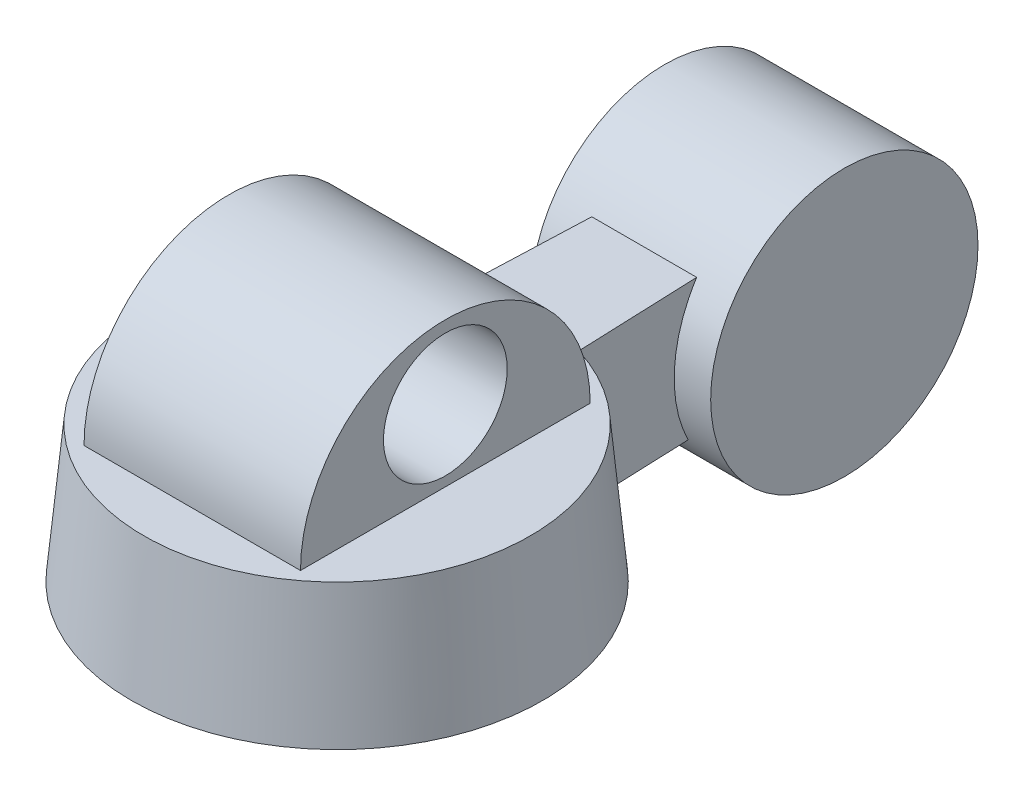
ISO-10303-21;
HEADER;
FILE_DESCRIPTION(('STEP AP214'),'2;1');
FILE_NAME('part.step','',(''),(''),'','','');
FILE_SCHEMA(('AUTOMOTIVE_DESIGN { 1 0 10303 214 1 1 1 1 }'));
ENDSEC;
DATA;
#1=APPLICATION_CONTEXT('core data for automotive mechanical design processes');
#2=APPLICATION_PROTOCOL_DEFINITION('international standard','automotive_design',2000,#1);
#3=PRODUCT_CONTEXT('',#1,'mechanical');
#4=PRODUCT('Part','Part','',(#3));
#5=PRODUCT_RELATED_PRODUCT_CATEGORY('part','',(#4));
#6=PRODUCT_DEFINITION_FORMATION('','',#4);
#7=PRODUCT_DEFINITION_CONTEXT('part definition',#1,'design');
#8=PRODUCT_DEFINITION('design','',#6,#7);
#9=PRODUCT_DEFINITION_SHAPE('','',#8);
#10=(LENGTH_UNIT() NAMED_UNIT(*) SI_UNIT(.MILLI.,.METRE.));
#11=(NAMED_UNIT(*) PLANE_ANGLE_UNIT() SI_UNIT($,.RADIAN.));
#12=(NAMED_UNIT(*) SI_UNIT($,.STERADIAN.) SOLID_ANGLE_UNIT());
#13=UNCERTAINTY_MEASURE_WITH_UNIT(LENGTH_MEASURE(1.E-05),#10,'distance_accuracy_value','');
#14=(GEOMETRIC_REPRESENTATION_CONTEXT(3) GLOBAL_UNCERTAINTY_ASSIGNED_CONTEXT((#13)) GLOBAL_UNIT_ASSIGNED_CONTEXT((#10,
#11,#12)) REPRESENTATION_CONTEXT('',''));
#15=CARTESIAN_POINT('',(0.,0.,0.));
#16=DIRECTION('',(0.,0.,1.));
#17=DIRECTION('',(1.,0.,0.));
#18=AXIS2_PLACEMENT_3D('',#15,#16,#17);
#19=CARTESIAN_POINT('',(0.,30.655768,0.));
#20=DIRECTION('',(0.,-1.,0.));
#21=DIRECTION('',(0.,0.,-1.));
#22=AXIS2_PLACEMENT_3D('',#19,#20,#21);
#23=CONICAL_SURFACE('',#22,43.5102,0.0933546059476239);
#24=CARTESIAN_POINT('',(0.,0.,0.));
#25=DIRECTION('',(0.,1.,0.));
#26=DIRECTION('',(0.,0.,1.));
#27=AXIS2_PLACEMENT_3D('',#24,#25,#26);
#28=CIRCLE('',#27,46.3804);
#29=CARTESIAN_POINT('',(-12.7674188321028,0.,-44.5885021112581));
#30=VERTEX_POINT('',#29);
#31=CARTESIAN_POINT('',(12.7674188321028,0.,-44.5885021112581));
#32=VERTEX_POINT('',#31);
#33=EDGE_CURVE('E165',#30,#32,#28,.T.);
#34=ORIENTED_EDGE('',*,*,#33,.T.);
#35=CARTESIAN_POINT('',(12.7674180703374,-0.0002,-44.5885218072551));
#36=CARTESIAN_POINT('',(12.7771487536088,2.55456907930935,-44.336927921107));
#37=CARTESIAN_POINT('',(12.7868874687462,5.10931768078186,-44.085126365225));
#38=CARTESIAN_POINT('',(12.8063818661739,10.2187714563628,-43.5810845553975));
#39=CARTESIAN_POINT('',(12.8161375484635,12.7734766304726,-43.3288443014663));
#40=CARTESIAN_POINT('',(12.8356667842856,17.8828412553839,-42.8239017196377));
#41=CARTESIAN_POINT('',(12.8454403378181,20.4375007061853,-42.5711993917388));
#42=CARTESIAN_POINT('',(12.8650063248149,25.5467712850946,-42.0653065815872));
#43=CARTESIAN_POINT('',(12.8747987582797,28.1013824132008,-41.8121160993185));
#44=CARTESIAN_POINT('',(12.8846011357482,30.655968,-41.5586685076115));
#45=B_SPLINE_CURVE_WITH_KNOTS('',3,(#35,#36,#37,#38,#39,#40,#41,#42,#43,#44),.UNSPECIFIED.,.F.,
.F.,(4,2,2,2,4),(0.,7.7014383672306,15.4028764810343,23.1043146177772,30.8057530079677),.UNSPECIFIED.);
#46=CARTESIAN_POINT('',(12.8846003683133,30.655768,-41.5586883501977));
#47=VERTEX_POINT('',#46);
#48=EDGE_CURVE('E114',#32,#47,#45,.T.);
#49=ORIENTED_EDGE('',*,*,#48,.T.);
#50=CARTESIAN_POINT('',(0.,30.655768,0.));
#51=DIRECTION('',(0.,1.,0.));
#52=DIRECTION('',(0.,0.,1.));
#53=AXIS2_PLACEMENT_3D('',#50,#51,#52);
#54=CIRCLE('',#53,43.5102);
#55=CARTESIAN_POINT('',(-12.8846003683133,30.655768,-41.5586883501977));
#56=VERTEX_POINT('',#55);
#57=EDGE_CURVE('E41',#56,#47,#54,.T.);
#58=ORIENTED_EDGE('',*,*,#57,.F.);
#59=CARTESIAN_POINT('',(-12.8846011357482,30.655968,-41.5586685076115));
#60=CARTESIAN_POINT('',(-12.8747987582797,28.1013824132008,-41.8121160993185));
#61=CARTESIAN_POINT('',(-12.8650063248149,25.5467712850946,-42.0653065815872));
#62=CARTESIAN_POINT('',(-12.8454403378181,20.4375007061853,-42.5711993917388));
#63=CARTESIAN_POINT('',(-12.8356667842856,17.8828412553839,-42.8239017196377));
#64=CARTESIAN_POINT('',(-12.8161375484635,12.7734766304726,-43.3288443014663));
#65=CARTESIAN_POINT('',(-12.8063818661739,10.2187714563627,-43.5810845553975));
#66=CARTESIAN_POINT('',(-12.7868874687462,5.10931768078186,-44.085126365225));
#67=CARTESIAN_POINT('',(-12.7771487536088,2.55456907930935,-44.336927921107));
#68=CARTESIAN_POINT('',(-12.7674180703374,-0.000200000000001914,-44.5885218072551));
#69=B_SPLINE_CURVE_WITH_KNOTS('',3,(#59,#60,#61,#62,#63,#64,#65,#66,#67,#68),.UNSPECIFIED.,.F.,
.F.,(4,2,2,2,4),(0.,7.70143839019049,15.4028765269334,23.1043146407371,30.8057530079677),.UNSPECIFIED.);
#70=EDGE_CURVE('E99',#56,#30,#69,.T.);
#71=ORIENTED_EDGE('',*,*,#70,.T.);
#72=EDGE_LOOP('',(#34,#49,#58,#71));
#73=FACE_BOUND('',#72,.T.);
#74=ADVANCED_FACE('F33',(#73),#23,.T.);
#75=CARTESIAN_POINT('',(-43.5102,30.655768,0.));
#76=DIRECTION('',(0.,1.,0.));
#77=DIRECTION('',(0.,0.,1.));
#78=AXIS2_PLACEMENT_3D('',#75,#76,#77);
#79=PLANE('',#78);
#80=DIRECTION('',(1.,0.,0.));
#81=VECTOR('',#80,1.);
#82=CARTESIAN_POINT('',(-20.236561,30.655768,-69.1785868719033));
#83=LINE('',#82,#81);
#84=CARTESIAN_POINT('',(-11.8163689871146,30.655768,-69.1785868719033));
#85=VERTEX_POINT('',#84);
#86=CARTESIAN_POINT('',(11.8163689871146,30.655768,-69.1785868719033));
#87=VERTEX_POINT('',#86);
#88=EDGE_CURVE('E85',#85,#87,#83,.T.);
#89=ORIENTED_EDGE('',*,*,#88,.F.);
#90=DIRECTION('',(-0.0386472572103373,0.,0.999252915687574));
#91=VECTOR('',#90,1.);
#92=CARTESIAN_POINT('',(-12.72794,30.655768,-45.609256));
#93=LINE('',#92,#91);
#94=EDGE_CURVE('E55',#85,#56,#93,.T.);
#95=ORIENTED_EDGE('',*,*,#94,.T.);
#96=ORIENTED_EDGE('',*,*,#57,.T.);
#97=DIRECTION('',(-0.0386472572103373,0.,-0.999252915687574));
#98=VECTOR('',#97,1.);
#99=CARTESIAN_POINT('',(12.9276453556837,30.655768,-40.4457289258982));
#100=LINE('',#99,#98);
#101=EDGE_CURVE('E93',#47,#87,#100,.T.);
#102=ORIENTED_EDGE('',*,*,#101,.T.);
#103=EDGE_LOOP('',(#89,#95,#96,#102));
#104=FACE_BOUND('',#103,.T.);
#105=DIRECTION('',(0.,0.,-1.));
#106=VECTOR('',#105,1.);
#107=CARTESIAN_POINT('',(-24.380571,30.655768,0.));
#108=LINE('',#107,#106);
#109=CARTESIAN_POINT('',(-24.380571,30.655768,32.625284));
#110=VERTEX_POINT('',#109);
#111=CARTESIAN_POINT('',(-24.380571,30.655768,-32.625284));
#112=VERTEX_POINT('',#111);
#113=EDGE_CURVE('E299',#110,#112,#108,.T.);
#114=ORIENTED_EDGE('',*,*,#113,.T.);
#115=DIRECTION('',(1.,0.,0.));
#116=VECTOR('',#115,1.);
#117=CARTESIAN_POINT('',(-24.380571,30.655768,-32.625284));
#118=LINE('',#117,#116);
#119=CARTESIAN_POINT('',(24.380571,30.655768,-32.625284));
#120=VERTEX_POINT('',#119);
#121=EDGE_CURVE('E291',#112,#120,#118,.T.);
#122=ORIENTED_EDGE('',*,*,#121,.T.);
#123=DIRECTION('',(0.,0.,-1.));
#124=VECTOR('',#123,1.);
#125=CARTESIAN_POINT('',(24.380571,30.655768,0.));
#126=LINE('',#125,#124);
#127=CARTESIAN_POINT('',(24.380571,30.655768,32.625284));
#128=VERTEX_POINT('',#127);
#129=EDGE_CURVE('E307',#128,#120,#126,.T.);
#130=ORIENTED_EDGE('',*,*,#129,.F.);
#131=DIRECTION('',(1.,0.,0.));
#132=VECTOR('',#131,1.);
#133=CARTESIAN_POINT('',(-24.380571,30.655768,32.625284));
#134=LINE('',#133,#132);
#135=EDGE_CURVE('E169',#110,#128,#134,.T.);
#136=ORIENTED_EDGE('',*,*,#135,.F.);
#137=EDGE_LOOP('',(#114,#122,#130,#136));
#138=FACE_BOUND('',#137,.T.);
#139=ADVANCED_FACE('F90',(#104,#138),#79,.T.);
#140=CARTESIAN_POINT('',(0.,11.70178,0.));
#141=DIRECTION('',(0.,-1.,0.));
#142=DIRECTION('',(0.,0.,-1.));
#143=AXIS2_PLACEMENT_3D('',#140,#141,#142);
#144=PLANE('',#143);
#145=CARTESIAN_POINT('',(0.,11.70178,0.));
#146=DIRECTION('',(0.,1.,0.));
#147=DIRECTION('',(0.,0.,1.));
#148=AXIS2_PLACEMENT_3D('',#145,#146,#147);
#149=CIRCLE('',#148,40.3145498);
#150=CARTESIAN_POINT('',(0.,11.70178,40.3145498));
#151=VERTEX_POINT('',#150);
#152=EDGE_CURVE('E286',#151,#151,#149,.T.);
#153=ORIENTED_EDGE('',*,*,#152,.F.);
#154=EDGE_LOOP('',(#153));
#155=FACE_BOUND('',#154,.T.);
#156=ADVANCED_FACE('F152',(#155),#144,.T.);
#157=CARTESIAN_POINT('',(0.,0.,0.));
#158=DIRECTION('',(0.,1.,0.));
#159=DIRECTION('',(0.,0.,1.));
#160=AXIS2_PLACEMENT_3D('',#157,#158,#159);
#161=CYLINDRICAL_SURFACE('',#160,40.3145498);
#162=ORIENTED_EDGE('',*,*,#152,.T.);
#163=EDGE_LOOP('',(#162));
#164=FACE_BOUND('',#163,.T.);
#165=CARTESIAN_POINT('',(0.,0.,0.));
#166=DIRECTION('',(0.,1.,0.));
#167=DIRECTION('',(0.,0.,1.));
#168=AXIS2_PLACEMENT_3D('',#165,#166,#167);
#169=CIRCLE('',#168,40.3145498);
#170=CARTESIAN_POINT('',(0.,0.,40.3145498));
#171=VERTEX_POINT('',#170);
#172=EDGE_CURVE('E168',#171,#171,#169,.T.);
#173=ORIENTED_EDGE('',*,*,#172,.F.);
#174=EDGE_LOOP('',(#173));
#175=FACE_BOUND('',#174,.T.);
#176=ADVANCED_FACE('F148',(#164,#175),#161,.F.);
#177=CARTESIAN_POINT('',(-40.3145498,0.,0.));
#178=DIRECTION('',(0.,-1.,0.));
#179=DIRECTION('',(0.,0.,-1.));
#180=AXIS2_PLACEMENT_3D('',#177,#178,#179);
#181=PLANE('',#180);
#182=DIRECTION('',(1.,0.,0.));
#183=VECTOR('',#182,1.);
#184=CARTESIAN_POINT('',(-20.236561,0.,-67.1735888107235));
#185=LINE('',#184,#183);
#186=CARTESIAN_POINT('',(11.8939145959992,0.,-67.1735888107235));
#187=VERTEX_POINT('',#186);
#188=CARTESIAN_POINT('',(-11.8939145959992,0.,-67.1735888107235));
#189=VERTEX_POINT('',#188);
#190=EDGE_CURVE('E48',#187,#189,#185,.F.);
#191=ORIENTED_EDGE('',*,*,#190,.F.);
#192=DIRECTION('',(-0.0386472572103373,0.,-0.999252915687574));
#193=VECTOR('',#192,1.);
#194=CARTESIAN_POINT('',(12.72794,0.,-45.609256));
#195=LINE('',#194,#193);
#196=EDGE_CURVE('E103',#32,#187,#195,.T.);
#197=ORIENTED_EDGE('',*,*,#196,.F.);
#198=ORIENTED_EDGE('',*,*,#33,.F.);
#199=DIRECTION('',(-0.0386472572103373,0.,0.999252915687574));
#200=VECTOR('',#199,1.);
#201=CARTESIAN_POINT('',(-10.780776,0.,-95.954596));
#202=LINE('',#201,#200);
#203=EDGE_CURVE('E100',#189,#30,#202,.T.);
#204=ORIENTED_EDGE('',*,*,#203,.F.);
#205=EDGE_LOOP('',(#191,#197,#198,#204));
#206=FACE_BOUND('',#205,.T.);
#207=ORIENTED_EDGE('',*,*,#172,.T.);
#208=EDGE_LOOP('',(#207));
#209=FACE_BOUND('',#208,.T.);
#210=ADVANCED_FACE('F144',(#206,#209),#181,.T.);
#211=CARTESIAN_POINT('',(-24.380571,30.655768,0.));
#212=DIRECTION('',(1.,0.,0.));
#213=DIRECTION('',(0.,0.,-1.));
#214=AXIS2_PLACEMENT_3D('',#211,#212,#213);
#215=CYLINDRICAL_SURFACE('',#214,32.625284);
#216=ORIENTED_EDGE('',*,*,#135,.T.);
#217=CARTESIAN_POINT('',(24.380571,30.655768,0.));
#218=DIRECTION('',(1.,0.,0.));
#219=DIRECTION('',(0.,0.,1.));
#220=AXIS2_PLACEMENT_3D('',#217,#218,#219);
#221=CIRCLE('',#220,32.625284);
#222=EDGE_CURVE('E305',#120,#128,#221,.T.);
#223=ORIENTED_EDGE('',*,*,#222,.F.);
#224=ORIENTED_EDGE('',*,*,#121,.F.);
#225=CARTESIAN_POINT('',(-24.380571,30.655768,0.));
#226=DIRECTION('',(1.,0.,0.));
#227=DIRECTION('',(0.,0.,1.));
#228=AXIS2_PLACEMENT_3D('',#225,#226,#227);
#229=CIRCLE('',#228,32.625284);
#230=EDGE_CURVE('E294',#112,#110,#229,.T.);
#231=ORIENTED_EDGE('',*,*,#230,.T.);
#232=EDGE_LOOP('',(#216,#223,#224,#231));
#233=FACE_BOUND('',#232,.T.);
#234=ADVANCED_FACE('F140',(#233),#215,.T.);
#235=CARTESIAN_POINT('',(-24.380571,30.655768,0.));
#236=DIRECTION('',(-1.,0.,0.));
#237=DIRECTION('',(0.,0.,1.));
#238=AXIS2_PLACEMENT_3D('',#235,#236,#237);
#239=PLANE('',#238);
#240=CARTESIAN_POINT('',(-24.380571,46.734476,0.));
#241=DIRECTION('',(1.,0.,0.));
#242=DIRECTION('',(0.,0.,-1.));
#243=AXIS2_PLACEMENT_3D('',#240,#241,#242);
#244=CIRCLE('',#243,13.935202);
#245=CARTESIAN_POINT('',(-24.380571,46.734476,-13.935202));
#246=VERTEX_POINT('',#245);
#247=EDGE_CURVE('E302',#246,#246,#244,.T.);
#248=ORIENTED_EDGE('',*,*,#247,.T.);
#249=EDGE_LOOP('',(#248));
#250=FACE_BOUND('',#249,.T.);
#251=ORIENTED_EDGE('',*,*,#113,.F.);
#252=ORIENTED_EDGE('',*,*,#230,.F.);
#253=EDGE_LOOP('',(#251,#252));
#254=FACE_BOUND('',#253,.T.);
#255=ADVANCED_FACE('F136',(#250,#254),#239,.T.);
#256=CARTESIAN_POINT('',(-24.380571,46.734476,0.));
#257=DIRECTION('',(1.,0.,0.));
#258=DIRECTION('',(0.,0.,-1.));
#259=AXIS2_PLACEMENT_3D('',#256,#257,#258);
#260=CYLINDRICAL_SURFACE('',#259,13.935202);
#261=ORIENTED_EDGE('',*,*,#247,.F.);
#262=EDGE_LOOP('',(#261));
#263=FACE_BOUND('',#262,.T.);
#264=CARTESIAN_POINT('',(24.380571,46.734476,0.));
#265=DIRECTION('',(1.,0.,0.));
#266=DIRECTION('',(0.,0.,-1.));
#267=AXIS2_PLACEMENT_3D('',#264,#265,#266);
#268=CIRCLE('',#267,13.935202);
#269=CARTESIAN_POINT('',(24.380571,46.734476,-13.935202));
#270=VERTEX_POINT('',#269);
#271=EDGE_CURVE('E171',#270,#270,#268,.T.);
#272=ORIENTED_EDGE('',*,*,#271,.T.);
#273=EDGE_LOOP('',(#272));
#274=FACE_BOUND('',#273,.T.);
#275=ADVANCED_FACE('F132',(#263,#274),#260,.F.);
#276=CARTESIAN_POINT('',(24.380571,30.655768,0.));
#277=DIRECTION('',(-1.,0.,0.));
#278=DIRECTION('',(0.,0.,1.));
#279=AXIS2_PLACEMENT_3D('',#276,#277,#278);
#280=PLANE('',#279);
#281=ORIENTED_EDGE('',*,*,#129,.T.);
#282=ORIENTED_EDGE('',*,*,#222,.T.);
#283=EDGE_LOOP('',(#281,#282));
#284=FACE_BOUND('',#283,.T.);
#285=ORIENTED_EDGE('',*,*,#271,.F.);
#286=EDGE_LOOP('',(#285));
#287=FACE_BOUND('',#286,.T.);
#288=ADVANCED_FACE('F128',(#284,#287),#280,.F.);
#289=CARTESIAN_POINT('',(12.72794,30.655768,-45.609256));
#290=DIRECTION('',(-0.999252915687574,0.,0.0386472572103373));
#291=DIRECTION('',(0.0386472572103373,0.,0.999252915687574));
#292=AXIS2_PLACEMENT_3D('',#289,#290,#291);
#293=PLANE('',#292);
#294=ORIENTED_EDGE('',*,*,#196,.T.);
#295=CARTESIAN_POINT('',(10.8558490401493,13.638022,-94.013528));
#296=DIRECTION('',(-0.999252915687574,0.,0.0386472572103373));
#297=DIRECTION('',(0.0386472572103373,0.,0.999252915687574));
#298=AXIS2_PLACEMENT_3D('',#295,#296,#297);
#299=ELLIPSE('',#298,30.1286206198201,30.106112);
#300=EDGE_CURVE('E94',#187,#87,#299,.T.);
#301=ORIENTED_EDGE('',*,*,#300,.T.);
#302=ORIENTED_EDGE('',*,*,#101,.F.);
#303=ORIENTED_EDGE('',*,*,#48,.F.);
#304=EDGE_LOOP('',(#294,#301,#302,#303));
#305=FACE_BOUND('',#304,.T.);
#306=ADVANCED_FACE('F123',(#305),#293,.F.);
#307=CARTESIAN_POINT('',(-10.780776,30.655768,-95.954596));
#308=DIRECTION('',(0.999252915687574,0.,0.0386472572103373));
#309=DIRECTION('',(0.0386472572103373,0.,-0.999252915687574));
#310=AXIS2_PLACEMENT_3D('',#307,#308,#309);
#311=PLANE('',#310);
#312=ORIENTED_EDGE('',*,*,#94,.F.);
#313=CARTESIAN_POINT('',(-10.8558490401493,13.638022,-94.013528));
#314=DIRECTION('',(0.999252915687574,0.,0.0386472572103373));
#315=DIRECTION('',(0.0386472572103373,0.,-0.999252915687574));
#316=AXIS2_PLACEMENT_3D('',#313,#314,#315);
#317=ELLIPSE('',#316,30.1286206198201,30.106112);
#318=EDGE_CURVE('E11',#85,#189,#317,.T.);
#319=ORIENTED_EDGE('',*,*,#318,.T.);
#320=ORIENTED_EDGE('',*,*,#203,.T.);
#321=ORIENTED_EDGE('',*,*,#70,.F.);
#322=EDGE_LOOP('',(#312,#319,#320,#321));
#323=FACE_BOUND('',#322,.T.);
#324=ADVANCED_FACE('F97',(#323),#311,.F.);
#325=CARTESIAN_POINT('',(-20.236561,13.638022,-94.013528));
#326=DIRECTION('',(1.,0.,0.));
#327=DIRECTION('',(0.,0.,-1.));
#328=AXIS2_PLACEMENT_3D('',#325,#326,#327);
#329=CYLINDRICAL_SURFACE('',#328,30.106112);
#330=CARTESIAN_POINT('',(20.236561,13.638022,-94.013528));
#331=DIRECTION('',(1.,0.,0.));
#332=DIRECTION('',(0.,0.,-1.));
#333=AXIS2_PLACEMENT_3D('',#330,#331,#332);
#334=CIRCLE('',#333,30.106112);
#335=CARTESIAN_POINT('',(20.236561,13.638022,-124.11964));
#336=VERTEX_POINT('',#335);
#337=EDGE_CURVE('E176',#336,#336,#334,.T.);
#338=ORIENTED_EDGE('',*,*,#337,.F.);
#339=EDGE_LOOP('',(#338));
#340=FACE_BOUND('',#339,.T.);
#341=CARTESIAN_POINT('',(-20.236561,13.638022,-94.013528));
#342=DIRECTION('',(1.,0.,0.));
#343=DIRECTION('',(0.,0.,-1.));
#344=AXIS2_PLACEMENT_3D('',#341,#342,#343);
#345=CIRCLE('',#344,30.106112);
#346=CARTESIAN_POINT('',(-20.236561,13.638022,-124.11964));
#347=VERTEX_POINT('',#346);
#348=EDGE_CURVE('E173',#347,#347,#345,.T.);
#349=ORIENTED_EDGE('',*,*,#348,.T.);
#350=EDGE_LOOP('',(#349));
#351=FACE_BOUND('',#350,.T.);
#352=ORIENTED_EDGE('',*,*,#300,.F.);
#353=ORIENTED_EDGE('',*,*,#190,.T.);
#354=ORIENTED_EDGE('',*,*,#318,.F.);
#355=ORIENTED_EDGE('',*,*,#88,.T.);
#356=EDGE_LOOP('',(#352,#353,#354,#355));
#357=FACE_BOUND('',#356,.T.);
#358=ADVANCED_FACE('F84',(#340,#351,#357),#329,.T.);
#359=CARTESIAN_POINT('',(-20.236561,13.638022,-94.013528));
#360=DIRECTION('',(1.,0.,0.));
#361=DIRECTION('',(0.,0.,-1.));
#362=AXIS2_PLACEMENT_3D('',#359,#360,#361);
#363=PLANE('',#362);
#364=ORIENTED_EDGE('',*,*,#348,.F.);
#365=EDGE_LOOP('',(#364));
#366=FACE_BOUND('',#365,.T.);
#367=ADVANCED_FACE('F186',(#366),#363,.F.);
#368=CARTESIAN_POINT('',(20.236561,13.638022,-94.013528));
#369=DIRECTION('',(1.,0.,0.));
#370=DIRECTION('',(0.,0.,-1.));
#371=AXIS2_PLACEMENT_3D('',#368,#369,#370);
#372=PLANE('',#371);
#373=ORIENTED_EDGE('',*,*,#337,.T.);
#374=EDGE_LOOP('',(#373));
#375=FACE_BOUND('',#374,.T.);
#376=ADVANCED_FACE('F182',(#375),#372,.T.);
#377=CLOSED_SHELL('',(#74,#139,#156,#176,#210,#234,#255,#275,#288,#306,#324,#358,#367,#376));
#378=MANIFOLD_SOLID_BREP('B2',#377);
#379=ADVANCED_BREP_SHAPE_REPRESENTATION('',(#18,#378),#14);
#380=SHAPE_DEFINITION_REPRESENTATION(#9,#379);
ENDSEC;
END-ISO-10303-21;
